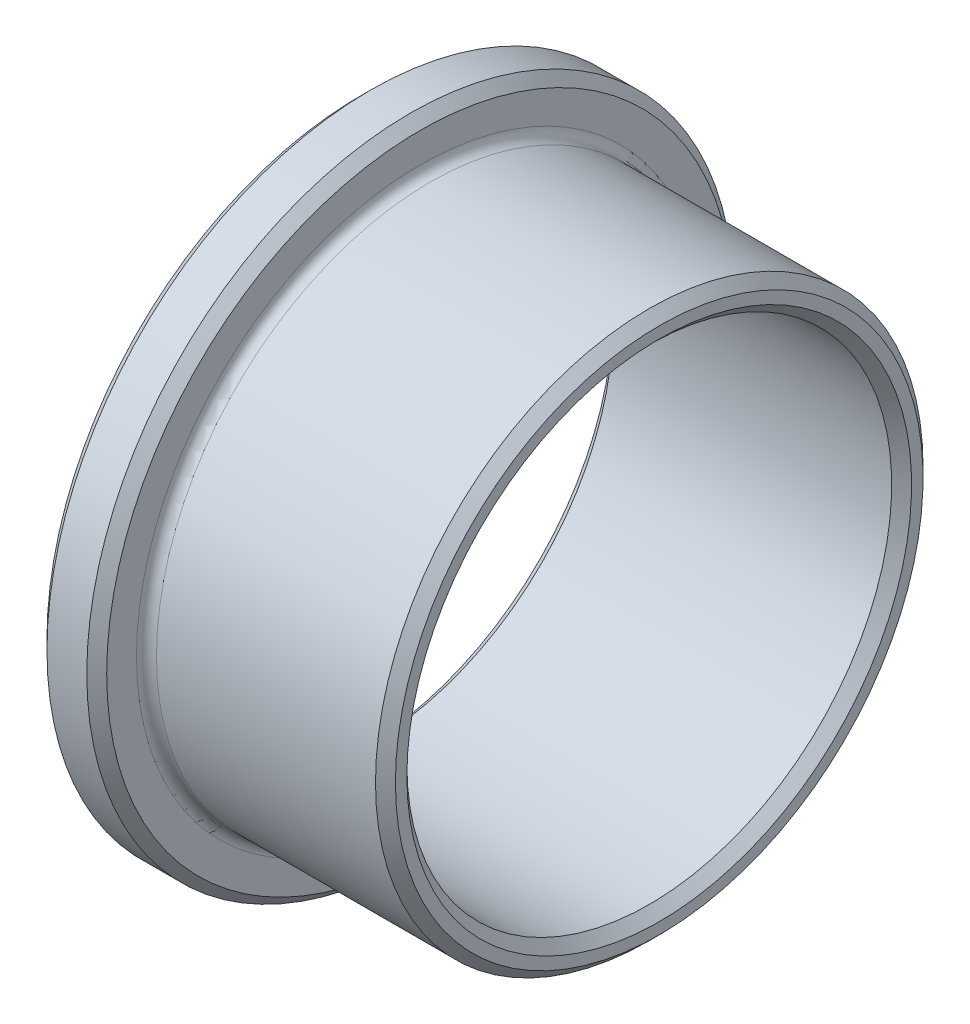
ISO-10303-21;
HEADER;
FILE_DESCRIPTION(('STEP AP214'),'2;1');
FILE_NAME('part.step','',(''),(''),'','','');
FILE_SCHEMA(('AUTOMOTIVE_DESIGN { 1 0 10303 214 1 1 1 1 }'));
ENDSEC;
DATA;
#1=APPLICATION_CONTEXT('core data for automotive mechanical design processes');
#2=APPLICATION_PROTOCOL_DEFINITION('international standard','automotive_design',2000,#1);
#3=PRODUCT_CONTEXT('',#1,'mechanical');
#4=PRODUCT('Part','Part','',(#3));
#5=PRODUCT_RELATED_PRODUCT_CATEGORY('part','',(#4));
#6=PRODUCT_DEFINITION_FORMATION('','',#4);
#7=PRODUCT_DEFINITION_CONTEXT('part definition',#1,'design');
#8=PRODUCT_DEFINITION('design','',#6,#7);
#9=PRODUCT_DEFINITION_SHAPE('','',#8);
#10=(LENGTH_UNIT() NAMED_UNIT(*) SI_UNIT(.MILLI.,.METRE.));
#11=(NAMED_UNIT(*) PLANE_ANGLE_UNIT() SI_UNIT($,.RADIAN.));
#12=(NAMED_UNIT(*) SI_UNIT($,.STERADIAN.) SOLID_ANGLE_UNIT());
#13=UNCERTAINTY_MEASURE_WITH_UNIT(LENGTH_MEASURE(1.E-05),#10,'distance_accuracy_value','');
#14=(GEOMETRIC_REPRESENTATION_CONTEXT(3) GLOBAL_UNCERTAINTY_ASSIGNED_CONTEXT((#13)) GLOBAL_UNIT_ASSIGNED_CONTEXT((#10,
#11,#12)) REPRESENTATION_CONTEXT('',''));
#15=CARTESIAN_POINT('',(0.,0.,0.));
#16=DIRECTION('',(0.,0.,1.));
#17=DIRECTION('',(1.,0.,0.));
#18=AXIS2_PLACEMENT_3D('',#15,#16,#17);
#19=CARTESIAN_POINT('',(0.,32.5,0.));
#20=DIRECTION('',(1.,0.,0.));
#21=DIRECTION('',(0.,0.,-1.));
#22=AXIS2_PLACEMENT_3D('',#19,#20,#21);
#23=PLANE('',#22);
#24=CARTESIAN_POINT('',(0.,0.,0.));
#25=DIRECTION('',(1.,0.,0.));
#26=DIRECTION('',(0.,0.,-1.));
#27=AXIS2_PLACEMENT_3D('',#24,#25,#26);
#28=CIRCLE('',#27,25.35);
#29=CARTESIAN_POINT('',(0.,0.,-25.35));
#30=VERTEX_POINT('',#29);
#31=EDGE_CURVE('E63',#30,#30,#28,.T.);
#32=ORIENTED_EDGE('',*,*,#31,.T.);
#33=EDGE_LOOP('',(#32));
#34=FACE_BOUND('',#33,.T.);
#35=CARTESIAN_POINT('',(0.,0.,0.));
#36=DIRECTION('',(1.,0.,0.));
#37=DIRECTION('',(0.,0.,-1.));
#38=AXIS2_PLACEMENT_3D('',#35,#36,#37);
#39=CIRCLE('',#38,31.5);
#40=CARTESIAN_POINT('',(0.,0.,-31.5));
#41=VERTEX_POINT('',#40);
#42=EDGE_CURVE('E66',#41,#41,#39,.F.);
#43=ORIENTED_EDGE('',*,*,#42,.T.);
#44=EDGE_LOOP('',(#43));
#45=FACE_BOUND('',#44,.T.);
#46=ADVANCED_FACE('F31',(#34,#45),#23,.F.);
#47=CARTESIAN_POINT('',(0.,0.,0.));
#48=DIRECTION('',(-1.,0.,0.));
#49=DIRECTION('',(0.,0.,1.));
#50=AXIS2_PLACEMENT_3D('',#47,#48,#49);
#51=CYLINDRICAL_SURFACE('',#50,24.35);
#52=CARTESIAN_POINT('',(0.999999999999984,0.,0.));
#53=DIRECTION('',(1.,0.,0.));
#54=DIRECTION('',(0.,0.,-1.));
#55=AXIS2_PLACEMENT_3D('',#52,#53,#54);
#56=CIRCLE('',#55,24.35);
#57=CARTESIAN_POINT('',(0.999999999999984,0.,-24.35));
#58=VERTEX_POINT('',#57);
#59=EDGE_CURVE('E69',#58,#58,#56,.F.);
#60=ORIENTED_EDGE('',*,*,#59,.T.);
#61=EDGE_LOOP('',(#60));
#62=FACE_BOUND('',#61,.T.);
#63=CARTESIAN_POINT('',(29.,0.,0.));
#64=DIRECTION('',(-1.,0.,0.));
#65=DIRECTION('',(0.,0.,1.));
#66=AXIS2_PLACEMENT_3D('',#63,#64,#65);
#67=CIRCLE('',#66,24.35);
#68=CARTESIAN_POINT('',(29.,0.,24.35));
#69=VERTEX_POINT('',#68);
#70=EDGE_CURVE('E72',#69,#69,#67,.F.);
#71=ORIENTED_EDGE('',*,*,#70,.T.);
#72=EDGE_LOOP('',(#71));
#73=FACE_BOUND('',#72,.T.);
#74=ADVANCED_FACE('F76',(#62,#73),#51,.F.);
#75=CARTESIAN_POINT('',(30.,24.35,0.));
#76=DIRECTION('',(-1.,0.,0.));
#77=DIRECTION('',(0.,0.,1.));
#78=AXIS2_PLACEMENT_3D('',#75,#76,#77);
#79=PLANE('',#78);
#80=CARTESIAN_POINT('',(30.,0.,0.));
#81=DIRECTION('',(-1.,0.,0.));
#82=DIRECTION('',(0.,0.,1.));
#83=AXIS2_PLACEMENT_3D('',#80,#81,#82);
#84=CIRCLE('',#83,25.35);
#85=CARTESIAN_POINT('',(30.,0.,25.35));
#86=VERTEX_POINT('',#85);
#87=EDGE_CURVE('E57',#86,#86,#84,.T.);
#88=ORIENTED_EDGE('',*,*,#87,.T.);
#89=EDGE_LOOP('',(#88));
#90=FACE_BOUND('',#89,.T.);
#91=CARTESIAN_POINT('',(30.,0.,0.));
#92=DIRECTION('',(-1.,0.,0.));
#93=DIRECTION('',(0.,0.,1.));
#94=AXIS2_PLACEMENT_3D('',#91,#92,#93);
#95=CIRCLE('',#94,26.5);
#96=CARTESIAN_POINT('',(30.,0.,26.5));
#97=VERTEX_POINT('',#96);
#98=EDGE_CURVE('E60',#97,#97,#95,.F.);
#99=ORIENTED_EDGE('',*,*,#98,.T.);
#100=EDGE_LOOP('',(#99));
#101=FACE_BOUND('',#100,.T.);
#102=ADVANCED_FACE('F86',(#90,#101),#79,.F.);
#103=CARTESIAN_POINT('',(0.,0.,0.));
#104=DIRECTION('',(-1.,0.,0.));
#105=DIRECTION('',(0.,0.,1.));
#106=AXIS2_PLACEMENT_3D('',#103,#104,#105);
#107=CYLINDRICAL_SURFACE('',#106,27.5);
#108=CARTESIAN_POINT('',(7.,0.,0.));
#109=DIRECTION('',(-1.,0.,0.));
#110=DIRECTION('',(0.,0.,1.));
#111=AXIS2_PLACEMENT_3D('',#108,#109,#110);
#112=CIRCLE('',#111,27.5);
#113=CARTESIAN_POINT('',(7.,0.,27.5));
#114=VERTEX_POINT('',#113);
#115=EDGE_CURVE('E10',#114,#114,#112,.F.);
#116=ORIENTED_EDGE('',*,*,#115,.T.);
#117=EDGE_LOOP('',(#116));
#118=FACE_BOUND('',#117,.T.);
#119=CARTESIAN_POINT('',(29.,0.,0.));
#120=DIRECTION('',(-1.,0.,0.));
#121=DIRECTION('',(0.,0.,1.));
#122=AXIS2_PLACEMENT_3D('',#119,#120,#121);
#123=CIRCLE('',#122,27.5);
#124=CARTESIAN_POINT('',(29.,0.,27.5));
#125=VERTEX_POINT('',#124);
#126=EDGE_CURVE('E42',#125,#125,#123,.T.);
#127=ORIENTED_EDGE('',*,*,#126,.T.);
#128=EDGE_LOOP('',(#127));
#129=FACE_BOUND('',#128,.T.);
#130=ADVANCED_FACE('F89',(#118,#129),#107,.T.);
#131=CARTESIAN_POINT('',(6.,27.5,0.));
#132=DIRECTION('',(-1.,0.,0.));
#133=DIRECTION('',(0.,0.,1.));
#134=AXIS2_PLACEMENT_3D('',#131,#132,#133);
#135=PLANE('',#134);
#136=CARTESIAN_POINT('',(6.,0.,0.));
#137=DIRECTION('',(-1.,0.,0.));
#138=DIRECTION('',(0.,0.,1.));
#139=AXIS2_PLACEMENT_3D('',#136,#137,#138);
#140=CIRCLE('',#139,28.5);
#141=CARTESIAN_POINT('',(6.,0.,28.5));
#142=VERTEX_POINT('',#141);
#143=EDGE_CURVE('E38',#142,#142,#140,.T.);
#144=ORIENTED_EDGE('',*,*,#143,.T.);
#145=EDGE_LOOP('',(#144));
#146=FACE_BOUND('',#145,.T.);
#147=CARTESIAN_POINT('',(6.,0.,0.));
#148=DIRECTION('',(-1.,0.,0.));
#149=DIRECTION('',(0.,0.,1.));
#150=AXIS2_PLACEMENT_3D('',#147,#148,#149);
#151=CIRCLE('',#150,31.5);
#152=CARTESIAN_POINT('',(6.,0.,31.5));
#153=VERTEX_POINT('',#152);
#154=EDGE_CURVE('E46',#153,#153,#151,.F.);
#155=ORIENTED_EDGE('',*,*,#154,.T.);
#156=EDGE_LOOP('',(#155));
#157=FACE_BOUND('',#156,.T.);
#158=ADVANCED_FACE('F100',(#146,#157),#135,.F.);
#159=CARTESIAN_POINT('',(0.,0.,0.));
#160=DIRECTION('',(-1.,0.,0.));
#161=DIRECTION('',(0.,0.,1.));
#162=AXIS2_PLACEMENT_3D('',#159,#160,#161);
#163=CYLINDRICAL_SURFACE('',#162,32.5);
#164=CARTESIAN_POINT('',(5.,0.,0.));
#165=DIRECTION('',(-1.,0.,0.));
#166=DIRECTION('',(0.,0.,1.));
#167=AXIS2_PLACEMENT_3D('',#164,#165,#166);
#168=CIRCLE('',#167,32.5);
#169=CARTESIAN_POINT('',(5.,0.,32.5));
#170=VERTEX_POINT('',#169);
#171=EDGE_CURVE('E51',#170,#170,#168,.T.);
#172=ORIENTED_EDGE('',*,*,#171,.T.);
#173=EDGE_LOOP('',(#172));
#174=FACE_BOUND('',#173,.T.);
#175=CARTESIAN_POINT('',(1.00000000000001,0.,0.));
#176=DIRECTION('',(1.,0.,0.));
#177=DIRECTION('',(0.,0.,-1.));
#178=AXIS2_PLACEMENT_3D('',#175,#176,#177);
#179=CIRCLE('',#178,32.5);
#180=CARTESIAN_POINT('',(1.00000000000001,0.,-32.5));
#181=VERTEX_POINT('',#180);
#182=EDGE_CURVE('E54',#181,#181,#179,.T.);
#183=ORIENTED_EDGE('',*,*,#182,.T.);
#184=EDGE_LOOP('',(#183));
#185=FACE_BOUND('',#184,.T.);
#186=ADVANCED_FACE('F105',(#174,#185),#163,.T.);
#187=CARTESIAN_POINT('',(0.999999999999984,0.,0.));
#188=DIRECTION('',(-1.,0.,0.));
#189=DIRECTION('',(0.,0.,1.));
#190=AXIS2_PLACEMENT_3D('',#187,#188,#189);
#191=CONICAL_SURFACE('',#190,24.35,0.785398163397455);
#192=ORIENTED_EDGE('',*,*,#31,.F.);
#193=EDGE_LOOP('',(#192));
#194=FACE_BOUND('',#193,.T.);
#195=ORIENTED_EDGE('',*,*,#59,.F.);
#196=EDGE_LOOP('',(#195));
#197=FACE_BOUND('',#196,.T.);
#198=ADVANCED_FACE('F82',(#194,#197),#191,.F.);
#199=CARTESIAN_POINT('',(30.,0.,0.));
#200=DIRECTION('',(1.,0.,0.));
#201=DIRECTION('',(0.,0.,-1.));
#202=AXIS2_PLACEMENT_3D('',#199,#200,#201);
#203=CONICAL_SURFACE('',#202,25.35,0.785398163397441);
#204=ORIENTED_EDGE('',*,*,#70,.F.);
#205=EDGE_LOOP('',(#204));
#206=FACE_BOUND('',#205,.T.);
#207=ORIENTED_EDGE('',*,*,#87,.F.);
#208=EDGE_LOOP('',(#207));
#209=FACE_BOUND('',#208,.T.);
#210=ADVANCED_FACE('F78',(#206,#209),#203,.F.);
#211=CARTESIAN_POINT('',(5.,0.,0.));
#212=DIRECTION('',(-1.,0.,0.));
#213=DIRECTION('',(0.,0.,1.));
#214=AXIS2_PLACEMENT_3D('',#211,#212,#213);
#215=CONICAL_SURFACE('',#214,32.5,0.785398163397452);
#216=ORIENTED_EDGE('',*,*,#154,.F.);
#217=EDGE_LOOP('',(#216));
#218=FACE_BOUND('',#217,.T.);
#219=ORIENTED_EDGE('',*,*,#171,.F.);
#220=EDGE_LOOP('',(#219));
#221=FACE_BOUND('',#220,.T.);
#222=ADVANCED_FACE('F81',(#218,#221),#215,.T.);
#223=CARTESIAN_POINT('',(0.,0.,0.));
#224=DIRECTION('',(1.,0.,0.));
#225=DIRECTION('',(0.,0.,-1.));
#226=AXIS2_PLACEMENT_3D('',#223,#224,#225);
#227=CONICAL_SURFACE('',#226,31.5,0.785398163397445);
#228=ORIENTED_EDGE('',*,*,#182,.F.);
#229=EDGE_LOOP('',(#228));
#230=FACE_BOUND('',#229,.T.);
#231=ORIENTED_EDGE('',*,*,#42,.F.);
#232=EDGE_LOOP('',(#231));
#233=FACE_BOUND('',#232,.T.);
#234=ADVANCED_FACE('F96',(#230,#233),#227,.T.);
#235=CARTESIAN_POINT('',(29.,0.,0.));
#236=DIRECTION('',(-1.,0.,0.));
#237=DIRECTION('',(0.,0.,1.));
#238=AXIS2_PLACEMENT_3D('',#235,#236,#237);
#239=CONICAL_SURFACE('',#238,27.5,0.78539816339745);
#240=ORIENTED_EDGE('',*,*,#98,.F.);
#241=EDGE_LOOP('',(#240));
#242=FACE_BOUND('',#241,.T.);
#243=ORIENTED_EDGE('',*,*,#126,.F.);
#244=EDGE_LOOP('',(#243));
#245=FACE_BOUND('',#244,.T.);
#246=ADVANCED_FACE('F93',(#242,#245),#239,.T.);
#247=CARTESIAN_POINT('',(7.,0.,0.));
#248=DIRECTION('',(-1.,0.,0.));
#249=DIRECTION('',(0.,0.,1.));
#250=AXIS2_PLACEMENT_3D('',#247,#248,#249);
#251=TOROIDAL_SURFACE('',#250,28.5,1.);
#252=ORIENTED_EDGE('',*,*,#115,.F.);
#253=EDGE_LOOP('',(#252));
#254=FACE_BOUND('',#253,.T.);
#255=ORIENTED_EDGE('',*,*,#143,.F.);
#256=EDGE_LOOP('',(#255));
#257=FACE_BOUND('',#256,.T.);
#258=ADVANCED_FACE('F33',(#254,#257),#251,.F.);
#259=CLOSED_SHELL('',(#46,#74,#102,#130,#158,#186,#198,#210,#222,#234,#246,#258));
#260=MANIFOLD_SOLID_BREP('B2',#259);
#261=ADVANCED_BREP_SHAPE_REPRESENTATION('',(#18,#260),#14);
#262=SHAPE_DEFINITION_REPRESENTATION(#9,#261);
ENDSEC;
END-ISO-10303-21;
